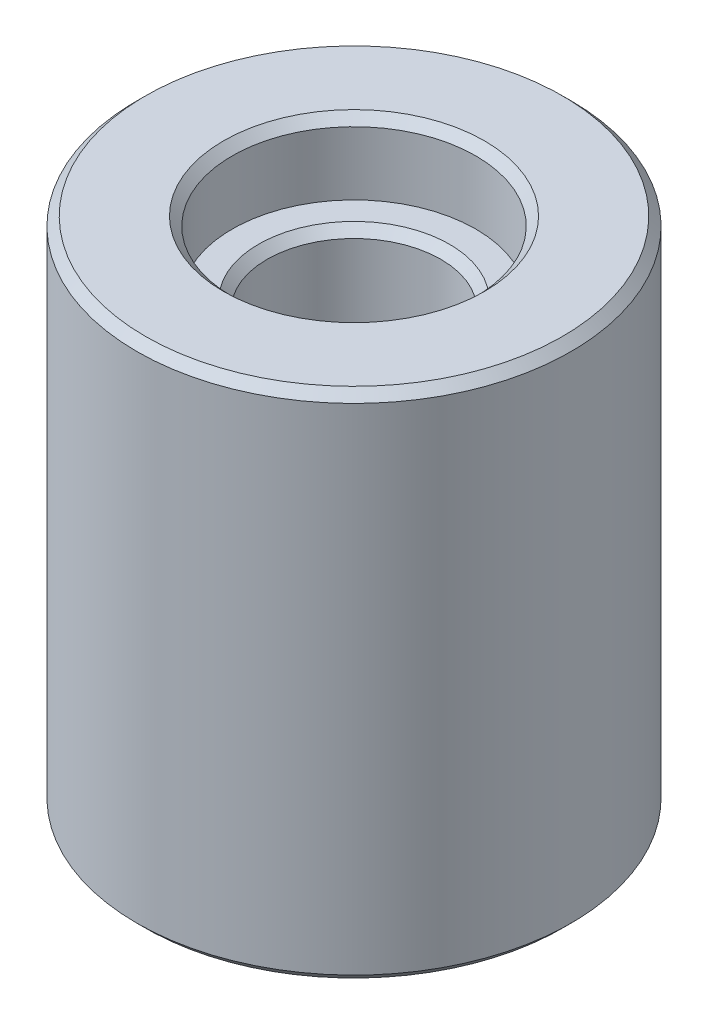
ISO-10303-21;
HEADER;
FILE_DESCRIPTION(('STEP AP214'),'2;1');
FILE_NAME('part.step','',(''),(''),'','','');
FILE_SCHEMA(('AUTOMOTIVE_DESIGN { 1 0 10303 214 1 1 1 1 }'));
ENDSEC;
DATA;
#1=APPLICATION_CONTEXT('core data for automotive mechanical design processes');
#2=APPLICATION_PROTOCOL_DEFINITION('international standard','automotive_design',2000,#1);
#3=PRODUCT_CONTEXT('',#1,'mechanical');
#4=PRODUCT('Part','Part','',(#3));
#5=PRODUCT_RELATED_PRODUCT_CATEGORY('part','',(#4));
#6=PRODUCT_DEFINITION_FORMATION('','',#4);
#7=PRODUCT_DEFINITION_CONTEXT('part definition',#1,'design');
#8=PRODUCT_DEFINITION('design','',#6,#7);
#9=PRODUCT_DEFINITION_SHAPE('','',#8);
#10=(LENGTH_UNIT() NAMED_UNIT(*) SI_UNIT(.MILLI.,.METRE.));
#11=(NAMED_UNIT(*) PLANE_ANGLE_UNIT() SI_UNIT($,.RADIAN.));
#12=(NAMED_UNIT(*) SI_UNIT($,.STERADIAN.) SOLID_ANGLE_UNIT());
#13=UNCERTAINTY_MEASURE_WITH_UNIT(LENGTH_MEASURE(1.E-05),#10,'distance_accuracy_value','');
#14=(GEOMETRIC_REPRESENTATION_CONTEXT(3) GLOBAL_UNCERTAINTY_ASSIGNED_CONTEXT((#13)) GLOBAL_UNIT_ASSIGNED_CONTEXT((#10,
#11,#12)) REPRESENTATION_CONTEXT('',''));
#15=CARTESIAN_POINT('',(0.,0.,0.));
#16=DIRECTION('',(0.,0.,1.));
#17=DIRECTION('',(1.,0.,0.));
#18=AXIS2_PLACEMENT_3D('',#15,#16,#17);
#19=CARTESIAN_POINT('',(-13.975,0.,0.));
#20=DIRECTION('',(0.,-1.,0.));
#21=DIRECTION('',(0.,0.,-1.));
#22=AXIS2_PLACEMENT_3D('',#19,#20,#21);
#23=PLANE('',#22);
#24=CARTESIAN_POINT('',(-1.36167772214882E-13,0.,-19.5));
#25=DIRECTION('',(0.,-1.,0.));
#26=DIRECTION('',(0.,0.,-1.));
#27=AXIS2_PLACEMENT_3D('',#24,#25,#26);
#28=CIRCLE('',#27,2.99999999999997);
#29=CARTESIAN_POINT('',(-1.36167772214882E-13,0.,-22.5));
#30=VERTEX_POINT('',#29);
#31=EDGE_CURVE('E155',#30,#30,#28,.F.);
#32=ORIENTED_EDGE('',*,*,#31,.T.);
#33=EDGE_LOOP('',(#32));
#34=FACE_BOUND('',#33,.T.);
#35=CARTESIAN_POINT('',(-19.5,0.,2.04251658322323E-13));
#36=DIRECTION('',(0.,-1.,0.));
#37=DIRECTION('',(0.,0.,-1.));
#38=AXIS2_PLACEMENT_3D('',#35,#36,#37);
#39=CIRCLE('',#38,2.99999999999998);
#40=CARTESIAN_POINT('',(-19.5,0.,-2.99999999999977));
#41=VERTEX_POINT('',#40);
#42=EDGE_CURVE('E152',#41,#41,#39,.F.);
#43=ORIENTED_EDGE('',*,*,#42,.T.);
#44=EDGE_LOOP('',(#43));
#45=FACE_BOUND('',#44,.T.);
#46=CARTESIAN_POINT('',(19.5,0.,0.));
#47=DIRECTION('',(0.,-1.,0.));
#48=DIRECTION('',(0.,0.,-1.));
#49=AXIS2_PLACEMENT_3D('',#46,#47,#48);
#50=CIRCLE('',#49,2.99999999999998);
#51=CARTESIAN_POINT('',(19.5,0.,-2.99999999999998));
#52=VERTEX_POINT('',#51);
#53=EDGE_CURVE('E149',#52,#52,#50,.F.);
#54=ORIENTED_EDGE('',*,*,#53,.T.);
#55=EDGE_LOOP('',(#54));
#56=FACE_BOUND('',#55,.T.);
#57=CARTESIAN_POINT('',(0.,0.,19.5));
#58=DIRECTION('',(0.,-1.,0.));
#59=DIRECTION('',(0.,0.,-1.));
#60=AXIS2_PLACEMENT_3D('',#57,#58,#59);
#61=CIRCLE('',#60,2.99999999999997);
#62=CARTESIAN_POINT('',(0.,0.,16.5));
#63=VERTEX_POINT('',#62);
#64=EDGE_CURVE('E146',#63,#63,#61,.F.);
#65=ORIENTED_EDGE('',*,*,#64,.T.);
#66=EDGE_LOOP('',(#65));
#67=FACE_BOUND('',#66,.T.);
#68=CARTESIAN_POINT('',(0.,0.,0.));
#69=DIRECTION('',(0.,-1.,0.));
#70=DIRECTION('',(0.,0.,-1.));
#71=AXIS2_PLACEMENT_3D('',#68,#69,#70);
#72=CIRCLE('',#71,24.);
#73=CARTESIAN_POINT('',(0.,0.,-24.));
#74=VERTEX_POINT('',#73);
#75=EDGE_CURVE('E140',#74,#74,#72,.T.);
#76=ORIENTED_EDGE('',*,*,#75,.T.);
#77=EDGE_LOOP('',(#76));
#78=FACE_BOUND('',#77,.T.);
#79=CARTESIAN_POINT('',(0.,0.,0.));
#80=DIRECTION('',(0.,-1.,0.));
#81=DIRECTION('',(0.,0.,-1.));
#82=AXIS2_PLACEMENT_3D('',#79,#80,#81);
#83=CIRCLE('',#82,14.975);
#84=CARTESIAN_POINT('',(0.,0.,-14.975));
#85=VERTEX_POINT('',#84);
#86=EDGE_CURVE('E107',#85,#85,#83,.F.);
#87=ORIENTED_EDGE('',*,*,#86,.T.);
#88=EDGE_LOOP('',(#87));
#89=FACE_BOUND('',#88,.T.);
#90=ADVANCED_FACE('F46',(#34,#45,#56,#67,#78,#89),#23,.T.);
#91=CARTESIAN_POINT('',(0.,0.,0.));
#92=DIRECTION('',(0.,1.,0.));
#93=DIRECTION('',(0.,0.,1.));
#94=AXIS2_PLACEMENT_3D('',#91,#92,#93);
#95=CYLINDRICAL_SURFACE('',#94,25.);
#96=CARTESIAN_POINT('',(0.,58.,0.));
#97=DIRECTION('',(0.,1.,0.));
#98=DIRECTION('',(0.,0.,1.));
#99=AXIS2_PLACEMENT_3D('',#96,#97,#98);
#100=CIRCLE('',#99,25.);
#101=CARTESIAN_POINT('',(0.,58.,25.));
#102=VERTEX_POINT('',#101);
#103=EDGE_CURVE('E137',#102,#102,#100,.F.);
#104=ORIENTED_EDGE('',*,*,#103,.T.);
#105=EDGE_LOOP('',(#104));
#106=FACE_BOUND('',#105,.T.);
#107=CARTESIAN_POINT('',(0.,1.,0.));
#108=DIRECTION('',(0.,-1.,0.));
#109=DIRECTION('',(0.,0.,-1.));
#110=AXIS2_PLACEMENT_3D('',#107,#108,#109);
#111=CIRCLE('',#110,25.);
#112=CARTESIAN_POINT('',(0.,1.,-25.));
#113=VERTEX_POINT('',#112);
#114=EDGE_CURVE('E134',#113,#113,#111,.F.);
#115=ORIENTED_EDGE('',*,*,#114,.T.);
#116=EDGE_LOOP('',(#115));
#117=FACE_BOUND('',#116,.T.);
#118=ADVANCED_FACE('F181',(#106,#117),#95,.T.);
#119=CARTESIAN_POINT('',(-25.,59.,0.));
#120=DIRECTION('',(0.,1.,0.));
#121=DIRECTION('',(0.,0.,1.));
#122=AXIS2_PLACEMENT_3D('',#119,#120,#121);
#123=PLANE('',#122);
#124=CARTESIAN_POINT('',(0.,59.,0.));
#125=DIRECTION('',(0.,1.,0.));
#126=DIRECTION('',(0.,0.,1.));
#127=AXIS2_PLACEMENT_3D('',#124,#125,#126);
#128=CIRCLE('',#127,24.);
#129=CARTESIAN_POINT('',(0.,59.,24.));
#130=VERTEX_POINT('',#129);
#131=EDGE_CURVE('E131',#130,#130,#128,.T.);
#132=ORIENTED_EDGE('',*,*,#131,.T.);
#133=EDGE_LOOP('',(#132));
#134=FACE_BOUND('',#133,.T.);
#135=CARTESIAN_POINT('',(0.,59.,0.));
#136=DIRECTION('',(0.,1.,0.));
#137=DIRECTION('',(0.,0.,1.));
#138=AXIS2_PLACEMENT_3D('',#135,#136,#137);
#139=CIRCLE('',#138,15.025);
#140=CARTESIAN_POINT('',(0.,59.,15.025));
#141=VERTEX_POINT('',#140);
#142=EDGE_CURVE('E116',#141,#141,#139,.F.);
#143=ORIENTED_EDGE('',*,*,#142,.T.);
#144=EDGE_LOOP('',(#143));
#145=FACE_BOUND('',#144,.T.);
#146=ADVANCED_FACE('F187',(#134,#145),#123,.T.);
#147=CARTESIAN_POINT('',(0.,0.,0.));
#148=DIRECTION('',(0.,1.,0.));
#149=DIRECTION('',(0.,0.,1.));
#150=AXIS2_PLACEMENT_3D('',#147,#148,#149);
#151=CYLINDRICAL_SURFACE('',#150,14.025);
#152=CARTESIAN_POINT('',(0.,58.,0.));
#153=DIRECTION('',(0.,1.,0.));
#154=DIRECTION('',(0.,0.,1.));
#155=AXIS2_PLACEMENT_3D('',#152,#153,#154);
#156=CIRCLE('',#155,14.025);
#157=CARTESIAN_POINT('',(0.,58.,14.025));
#158=VERTEX_POINT('',#157);
#159=EDGE_CURVE('E113',#158,#158,#156,.T.);
#160=ORIENTED_EDGE('',*,*,#159,.T.);
#161=EDGE_LOOP('',(#160));
#162=FACE_BOUND('',#161,.T.);
#163=CARTESIAN_POINT('',(0.,50.7,0.));
#164=DIRECTION('',(0.,1.,0.));
#165=DIRECTION('',(0.,0.,1.));
#166=AXIS2_PLACEMENT_3D('',#163,#164,#165);
#167=CIRCLE('',#166,14.025);
#168=CARTESIAN_POINT('',(0.,50.7,14.025));
#169=VERTEX_POINT('',#168);
#170=EDGE_CURVE('E104',#169,#169,#167,.T.);
#171=ORIENTED_EDGE('',*,*,#170,.F.);
#172=EDGE_LOOP('',(#171));
#173=FACE_BOUND('',#172,.T.);
#174=ADVANCED_FACE('F308',(#162,#173),#151,.F.);
#175=CARTESIAN_POINT('',(-14.025,50.7,0.));
#176=DIRECTION('',(0.,1.,0.));
#177=DIRECTION('',(0.,0.,1.));
#178=AXIS2_PLACEMENT_3D('',#175,#176,#177);
#179=PLANE('',#178);
#180=CARTESIAN_POINT('',(0.,50.7,0.));
#181=DIRECTION('',(0.,1.,0.));
#182=DIRECTION('',(0.,0.,1.));
#183=AXIS2_PLACEMENT_3D('',#180,#181,#182);
#184=CIRCLE('',#183,11.);
#185=CARTESIAN_POINT('',(0.,50.7,11.));
#186=VERTEX_POINT('',#185);
#187=EDGE_CURVE('E128',#186,#186,#184,.F.);
#188=ORIENTED_EDGE('',*,*,#187,.T.);
#189=EDGE_LOOP('',(#188));
#190=FACE_BOUND('',#189,.T.);
#191=ORIENTED_EDGE('',*,*,#170,.T.);
#192=EDGE_LOOP('',(#191));
#193=FACE_BOUND('',#192,.T.);
#194=ADVANCED_FACE('F304',(#190,#193),#179,.T.);
#195=CARTESIAN_POINT('',(0.,0.,0.));
#196=DIRECTION('',(0.,1.,0.));
#197=DIRECTION('',(0.,0.,1.));
#198=AXIS2_PLACEMENT_3D('',#195,#196,#197);
#199=CYLINDRICAL_SURFACE('',#198,10.);
#200=CARTESIAN_POINT('',(0.,12.9998958328812,0.));
#201=DIRECTION('',(0.,-1.,0.));
#202=DIRECTION('',(0.,0.,-1.));
#203=AXIS2_PLACEMENT_3D('',#200,#201,#202);
#204=CIRCLE('',#203,10.);
#205=CARTESIAN_POINT('',(0.,12.9998958328812,-10.));
#206=VERTEX_POINT('',#205);
#207=EDGE_CURVE('E125',#206,#206,#204,.T.);
#208=ORIENTED_EDGE('',*,*,#207,.T.);
#209=EDGE_LOOP('',(#208));
#210=FACE_BOUND('',#209,.T.);
#211=CARTESIAN_POINT('',(0.,49.7,0.));
#212=DIRECTION('',(0.,1.,0.));
#213=DIRECTION('',(0.,0.,1.));
#214=AXIS2_PLACEMENT_3D('',#211,#212,#213);
#215=CIRCLE('',#214,10.);
#216=CARTESIAN_POINT('',(0.,49.7,10.));
#217=VERTEX_POINT('',#216);
#218=EDGE_CURVE('E122',#217,#217,#215,.T.);
#219=ORIENTED_EDGE('',*,*,#218,.T.);
#220=EDGE_LOOP('',(#219));
#221=FACE_BOUND('',#220,.T.);
#222=ADVANCED_FACE('F300',(#210,#221),#199,.F.);
#223=CARTESIAN_POINT('',(-10.,11.9998958328812,0.));
#224=DIRECTION('',(0.,-1.,0.));
#225=DIRECTION('',(0.,0.,-1.));
#226=AXIS2_PLACEMENT_3D('',#223,#224,#225);
#227=PLANE('',#226);
#228=CARTESIAN_POINT('',(0.,11.9998958328812,0.));
#229=DIRECTION('',(0.,-1.,0.));
#230=DIRECTION('',(0.,0.,-1.));
#231=AXIS2_PLACEMENT_3D('',#228,#229,#230);
#232=CIRCLE('',#231,11.);
#233=CARTESIAN_POINT('',(0.,11.9998958328812,-11.));
#234=VERTEX_POINT('',#233);
#235=EDGE_CURVE('E119',#234,#234,#232,.F.);
#236=ORIENTED_EDGE('',*,*,#235,.T.);
#237=EDGE_LOOP('',(#236));
#238=FACE_BOUND('',#237,.T.);
#239=CARTESIAN_POINT('',(0.,11.9998958328812,0.));
#240=DIRECTION('',(0.,1.,0.));
#241=DIRECTION('',(0.,0.,1.));
#242=AXIS2_PLACEMENT_3D('',#239,#240,#241);
#243=CIRCLE('',#242,14.025);
#244=CARTESIAN_POINT('',(0.,11.9998958328812,14.025));
#245=VERTEX_POINT('',#244);
#246=EDGE_CURVE('E101',#245,#245,#243,.T.);
#247=ORIENTED_EDGE('',*,*,#246,.F.);
#248=EDGE_LOOP('',(#247));
#249=FACE_BOUND('',#248,.T.);
#250=ADVANCED_FACE('F296',(#238,#249),#227,.T.);
#251=CARTESIAN_POINT('',(0.,0.,0.));
#252=DIRECTION('',(0.,1.,0.));
#253=DIRECTION('',(0.,0.,1.));
#254=AXIS2_PLACEMENT_3D('',#251,#252,#253);
#255=CYLINDRICAL_SURFACE('',#254,14.025);
#256=ORIENTED_EDGE('',*,*,#246,.T.);
#257=EDGE_LOOP('',(#256));
#258=FACE_BOUND('',#257,.T.);
#259=CARTESIAN_POINT('',(0.,3.99989583288123,0.));
#260=DIRECTION('',(0.,1.,0.));
#261=DIRECTION('',(0.,0.,1.));
#262=AXIS2_PLACEMENT_3D('',#259,#260,#261);
#263=CIRCLE('',#262,14.025);
#264=CARTESIAN_POINT('',(0.,3.99989583288123,14.025));
#265=VERTEX_POINT('',#264);
#266=EDGE_CURVE('E98',#265,#265,#263,.T.);
#267=ORIENTED_EDGE('',*,*,#266,.F.);
#268=EDGE_LOOP('',(#267));
#269=FACE_BOUND('',#268,.T.);
#270=ADVANCED_FACE('F292',(#258,#269),#255,.F.);
#271=CARTESIAN_POINT('',(-14.025,3.99989583288123,0.));
#272=DIRECTION('',(0.,-1.,0.));
#273=DIRECTION('',(0.,0.,-1.));
#274=AXIS2_PLACEMENT_3D('',#271,#272,#273);
#275=PLANE('',#274);
#276=ORIENTED_EDGE('',*,*,#266,.T.);
#277=EDGE_LOOP('',(#276));
#278=FACE_BOUND('',#277,.T.);
#279=CARTESIAN_POINT('',(0.,3.99989583288123,0.));
#280=DIRECTION('',(0.,1.,0.));
#281=DIRECTION('',(0.,0.,1.));
#282=AXIS2_PLACEMENT_3D('',#279,#280,#281);
#283=CIRCLE('',#282,14.6);
#284=CARTESIAN_POINT('',(0.,3.99989583288123,14.6));
#285=VERTEX_POINT('',#284);
#286=EDGE_CURVE('E95',#285,#285,#283,.T.);
#287=ORIENTED_EDGE('',*,*,#286,.F.);
#288=EDGE_LOOP('',(#287));
#289=FACE_BOUND('',#288,.T.);
#290=ADVANCED_FACE('F288',(#278,#289),#275,.T.);
#291=CARTESIAN_POINT('',(0.,0.,0.));
#292=DIRECTION('',(0.,1.,0.));
#293=DIRECTION('',(0.,0.,1.));
#294=AXIS2_PLACEMENT_3D('',#291,#292,#293);
#295=CYLINDRICAL_SURFACE('',#294,14.6);
#296=ORIENTED_EDGE('',*,*,#286,.T.);
#297=EDGE_LOOP('',(#296));
#298=FACE_BOUND('',#297,.T.);
#299=CARTESIAN_POINT('',(0.,2.69989583288123,0.));
#300=DIRECTION('',(0.,1.,0.));
#301=DIRECTION('',(0.,0.,1.));
#302=AXIS2_PLACEMENT_3D('',#299,#300,#301);
#303=CIRCLE('',#302,14.6);
#304=CARTESIAN_POINT('',(0.,2.69989583288123,14.6));
#305=VERTEX_POINT('',#304);
#306=EDGE_CURVE('E92',#305,#305,#303,.T.);
#307=ORIENTED_EDGE('',*,*,#306,.F.);
#308=EDGE_LOOP('',(#307));
#309=FACE_BOUND('',#308,.T.);
#310=ADVANCED_FACE('F284',(#298,#309),#295,.F.);
#311=CARTESIAN_POINT('',(-14.6,2.69989583288123,0.));
#312=DIRECTION('',(0.,1.,0.));
#313=DIRECTION('',(0.,0.,1.));
#314=AXIS2_PLACEMENT_3D('',#311,#312,#313);
#315=PLANE('',#314);
#316=ORIENTED_EDGE('',*,*,#306,.T.);
#317=EDGE_LOOP('',(#316));
#318=FACE_BOUND('',#317,.T.);
#319=CARTESIAN_POINT('',(0.,2.69989583288123,0.));
#320=DIRECTION('',(0.,1.,0.));
#321=DIRECTION('',(0.,0.,1.));
#322=AXIS2_PLACEMENT_3D('',#319,#320,#321);
#323=CIRCLE('',#322,13.975);
#324=CARTESIAN_POINT('',(0.,2.69989583288123,13.975));
#325=VERTEX_POINT('',#324);
#326=EDGE_CURVE('E89',#325,#325,#323,.T.);
#327=ORIENTED_EDGE('',*,*,#326,.F.);
#328=EDGE_LOOP('',(#327));
#329=FACE_BOUND('',#328,.T.);
#330=ADVANCED_FACE('F280',(#318,#329),#315,.T.);
#331=CARTESIAN_POINT('',(0.,0.,0.));
#332=DIRECTION('',(0.,1.,0.));
#333=DIRECTION('',(0.,0.,1.));
#334=AXIS2_PLACEMENT_3D('',#331,#332,#333);
#335=CYLINDRICAL_SURFACE('',#334,13.975);
#336=CARTESIAN_POINT('',(0.,1.00000000000001,0.));
#337=DIRECTION('',(0.,-1.,0.));
#338=DIRECTION('',(0.,0.,-1.));
#339=AXIS2_PLACEMENT_3D('',#336,#337,#338);
#340=CIRCLE('',#339,13.975);
#341=CARTESIAN_POINT('',(0.,1.00000000000001,-13.975));
#342=VERTEX_POINT('',#341);
#343=EDGE_CURVE('E110',#342,#342,#340,.T.);
#344=ORIENTED_EDGE('',*,*,#343,.T.);
#345=EDGE_LOOP('',(#344));
#346=FACE_BOUND('',#345,.T.);
#347=ORIENTED_EDGE('',*,*,#326,.T.);
#348=EDGE_LOOP('',(#347));
#349=FACE_BOUND('',#348,.T.);
#350=ADVANCED_FACE('F201',(#346,#349),#335,.F.);
#351=CARTESIAN_POINT('',(0.,0.,0.));
#352=DIRECTION('',(0.,-1.,0.));
#353=DIRECTION('',(0.,0.,-1.));
#354=AXIS2_PLACEMENT_3D('',#351,#352,#353);
#355=CONICAL_SURFACE('',#354,14.975,0.785398163397451);
#356=ORIENTED_EDGE('',*,*,#343,.F.);
#357=EDGE_LOOP('',(#356));
#358=FACE_BOUND('',#357,.T.);
#359=ORIENTED_EDGE('',*,*,#86,.F.);
#360=EDGE_LOOP('',(#359));
#361=FACE_BOUND('',#360,.T.);
#362=ADVANCED_FACE('F194',(#358,#361),#355,.F.);
#363=CARTESIAN_POINT('',(0.,58.,0.));
#364=DIRECTION('',(0.,1.,0.));
#365=DIRECTION('',(0.,0.,1.));
#366=AXIS2_PLACEMENT_3D('',#363,#364,#365);
#367=CONICAL_SURFACE('',#366,14.025,0.785398163397449);
#368=ORIENTED_EDGE('',*,*,#142,.F.);
#369=EDGE_LOOP('',(#368));
#370=FACE_BOUND('',#369,.T.);
#371=ORIENTED_EDGE('',*,*,#159,.F.);
#372=EDGE_LOOP('',(#371));
#373=FACE_BOUND('',#372,.T.);
#374=ADVANCED_FACE('F200',(#370,#373),#367,.F.);
#375=CARTESIAN_POINT('',(0.,11.9998958328812,0.));
#376=DIRECTION('',(0.,-1.,0.));
#377=DIRECTION('',(0.,0.,-1.));
#378=AXIS2_PLACEMENT_3D('',#375,#376,#377);
#379=CONICAL_SURFACE('',#378,11.,0.785398163397445);
#380=ORIENTED_EDGE('',*,*,#207,.F.);
#381=EDGE_LOOP('',(#380));
#382=FACE_BOUND('',#381,.T.);
#383=ORIENTED_EDGE('',*,*,#235,.F.);
#384=EDGE_LOOP('',(#383));
#385=FACE_BOUND('',#384,.T.);
#386=ADVANCED_FACE('F208',(#382,#385),#379,.F.);
#387=CARTESIAN_POINT('',(0.,49.7,0.));
#388=DIRECTION('',(0.,1.,0.));
#389=DIRECTION('',(0.,0.,1.));
#390=AXIS2_PLACEMENT_3D('',#387,#388,#389);
#391=CONICAL_SURFACE('',#390,10.,0.785398163397452);
#392=ORIENTED_EDGE('',*,*,#187,.F.);
#393=EDGE_LOOP('',(#392));
#394=FACE_BOUND('',#393,.T.);
#395=ORIENTED_EDGE('',*,*,#218,.F.);
#396=EDGE_LOOP('',(#395));
#397=FACE_BOUND('',#396,.T.);
#398=ADVANCED_FACE('F215',(#394,#397),#391,.F.);
#399=CARTESIAN_POINT('',(19.5,12.,0.));
#400=DIRECTION('',(0.,-1.,0.));
#401=DIRECTION('',(0.,0.,-1.));
#402=AXIS2_PLACEMENT_3D('',#399,#400,#401);
#403=CONICAL_SURFACE('',#402,2.5,1.02974425867665);
#404=CARTESIAN_POINT('',(19.5,13.5021515475689,0.));
#405=VERTEX_POINT('',#404);
#406=VERTEX_LOOP('',#405);
#407=FACE_BOUND('',#406,.T.);
#408=CARTESIAN_POINT('',(19.5,12.,0.));
#409=DIRECTION('',(0.,-1.,0.));
#410=DIRECTION('',(0.,0.,-1.));
#411=AXIS2_PLACEMENT_3D('',#408,#409,#410);
#412=CIRCLE('',#411,2.5);
#413=CARTESIAN_POINT('',(19.5,12.,-2.5));
#414=VERTEX_POINT('',#413);
#415=EDGE_CURVE('E86',#414,#414,#412,.T.);
#416=ORIENTED_EDGE('',*,*,#415,.T.);
#417=EDGE_LOOP('',(#416));
#418=FACE_BOUND('',#417,.T.);
#419=ADVANCED_FACE('F222',(#407,#418),#403,.F.);
#420=CARTESIAN_POINT('',(19.5,0.,0.));
#421=DIRECTION('',(0.,-1.,0.));
#422=DIRECTION('',(0.,0.,-1.));
#423=AXIS2_PLACEMENT_3D('',#420,#421,#422);
#424=CYLINDRICAL_SURFACE('',#423,2.5);
#425=CARTESIAN_POINT('',(19.5,0.499999999999984,0.));
#426=DIRECTION('',(0.,-1.,0.));
#427=DIRECTION('',(0.,0.,-1.));
#428=AXIS2_PLACEMENT_3D('',#425,#426,#427);
#429=CIRCLE('',#428,2.5);
#430=CARTESIAN_POINT('',(19.5,0.499999999999984,-2.5));
#431=VERTEX_POINT('',#430);
#432=EDGE_CURVE('E55',#431,#431,#429,.T.);
#433=ORIENTED_EDGE('',*,*,#432,.T.);
#434=EDGE_LOOP('',(#433));
#435=FACE_BOUND('',#434,.T.);
#436=ORIENTED_EDGE('',*,*,#415,.F.);
#437=EDGE_LOOP('',(#436));
#438=FACE_BOUND('',#437,.T.);
#439=ADVANCED_FACE('F163',(#435,#438),#424,.F.);
#440=CARTESIAN_POINT('',(0.,12.,19.5));
#441=DIRECTION('',(0.,-1.,0.));
#442=DIRECTION('',(0.,0.,-1.));
#443=AXIS2_PLACEMENT_3D('',#440,#441,#442);
#444=CONICAL_SURFACE('',#443,2.5,1.02974425867665);
#445=CARTESIAN_POINT('',(0.,13.5021515475689,19.5));
#446=VERTEX_POINT('',#445);
#447=VERTEX_LOOP('',#446);
#448=FACE_BOUND('',#447,.T.);
#449=CARTESIAN_POINT('',(0.,12.,19.5));
#450=DIRECTION('',(0.,-1.,0.));
#451=DIRECTION('',(0.,0.,-1.));
#452=AXIS2_PLACEMENT_3D('',#449,#450,#451);
#453=CIRCLE('',#452,2.5);
#454=CARTESIAN_POINT('',(0.,12.,17.));
#455=VERTEX_POINT('',#454);
#456=EDGE_CURVE('E81',#455,#455,#453,.T.);
#457=ORIENTED_EDGE('',*,*,#456,.T.);
#458=EDGE_LOOP('',(#457));
#459=FACE_BOUND('',#458,.T.);
#460=ADVANCED_FACE('F270',(#448,#459),#444,.F.);
#461=CARTESIAN_POINT('',(0.,0.,19.5));
#462=DIRECTION('',(0.,-1.,0.));
#463=DIRECTION('',(0.,0.,-1.));
#464=AXIS2_PLACEMENT_3D('',#461,#462,#463);
#465=CYLINDRICAL_SURFACE('',#464,2.49999999999999);
#466=CARTESIAN_POINT('',(0.,0.499999999999986,19.5));
#467=DIRECTION('',(0.,-1.,0.));
#468=DIRECTION('',(0.,0.,-1.));
#469=AXIS2_PLACEMENT_3D('',#466,#467,#468);
#470=CIRCLE('',#469,2.49999999999999);
#471=CARTESIAN_POINT('',(0.,0.499999999999986,17.));
#472=VERTEX_POINT('',#471);
#473=EDGE_CURVE('E11',#472,#472,#470,.T.);
#474=ORIENTED_EDGE('',*,*,#473,.T.);
#475=EDGE_LOOP('',(#474));
#476=FACE_BOUND('',#475,.T.);
#477=ORIENTED_EDGE('',*,*,#456,.F.);
#478=EDGE_LOOP('',(#477));
#479=FACE_BOUND('',#478,.T.);
#480=ADVANCED_FACE('F266',(#476,#479),#465,.F.);
#481=CARTESIAN_POINT('',(-19.5,12.,2.04251658322323E-13));
#482=DIRECTION('',(0.,-1.,0.));
#483=DIRECTION('',(0.,0.,-1.));
#484=AXIS2_PLACEMENT_3D('',#481,#482,#483);
#485=CONICAL_SURFACE('',#484,2.5,1.02974425867665);
#486=CARTESIAN_POINT('',(-19.5,13.5021515475689,2.04251658322323E-13));
#487=VERTEX_POINT('',#486);
#488=VERTEX_LOOP('',#487);
#489=FACE_BOUND('',#488,.T.);
#490=CARTESIAN_POINT('',(-19.5,12.,2.04251658322323E-13));
#491=DIRECTION('',(0.,-1.,0.));
#492=DIRECTION('',(0.,0.,-1.));
#493=AXIS2_PLACEMENT_3D('',#490,#491,#492);
#494=CIRCLE('',#493,2.5);
#495=CARTESIAN_POINT('',(-19.5,12.,-2.49999999999979));
#496=VERTEX_POINT('',#495);
#497=EDGE_CURVE('E78',#496,#496,#494,.T.);
#498=ORIENTED_EDGE('',*,*,#497,.T.);
#499=EDGE_LOOP('',(#498));
#500=FACE_BOUND('',#499,.T.);
#501=ADVANCED_FACE('F262',(#489,#500),#485,.F.);
#502=CARTESIAN_POINT('',(-19.5,0.,2.04251658322323E-13));
#503=DIRECTION('',(0.,-1.,0.));
#504=DIRECTION('',(0.,0.,-1.));
#505=AXIS2_PLACEMENT_3D('',#502,#503,#504);
#506=CYLINDRICAL_SURFACE('',#505,2.5);
#507=CARTESIAN_POINT('',(-19.5,0.499999999999984,2.04251658322323E-13));
#508=DIRECTION('',(0.,-1.,0.));
#509=DIRECTION('',(0.,0.,-1.));
#510=AXIS2_PLACEMENT_3D('',#507,#508,#509);
#511=CIRCLE('',#510,2.5);
#512=CARTESIAN_POINT('',(-19.5,0.499999999999984,-2.49999999999979));
#513=VERTEX_POINT('',#512);
#514=EDGE_CURVE('E158',#513,#513,#511,.T.);
#515=ORIENTED_EDGE('',*,*,#514,.T.);
#516=EDGE_LOOP('',(#515));
#517=FACE_BOUND('',#516,.T.);
#518=ORIENTED_EDGE('',*,*,#497,.F.);
#519=EDGE_LOOP('',(#518));
#520=FACE_BOUND('',#519,.T.);
#521=ADVANCED_FACE('F72',(#517,#520),#506,.F.);
#522=CARTESIAN_POINT('',(-1.36167772214882E-13,12.,-19.5));
#523=DIRECTION('',(0.,-1.,0.));
#524=DIRECTION('',(0.,0.,-1.));
#525=AXIS2_PLACEMENT_3D('',#522,#523,#524);
#526=CONICAL_SURFACE('',#525,2.5,1.02974425867665);
#527=CARTESIAN_POINT('',(-1.39474845549749E-13,13.5021515475689,-19.5));
#528=VERTEX_POINT('',#527);
#529=VERTEX_LOOP('',#528);
#530=FACE_BOUND('',#529,.T.);
#531=CARTESIAN_POINT('',(-1.36167772214882E-13,12.,-19.5));
#532=DIRECTION('',(0.,-1.,0.));
#533=DIRECTION('',(0.,0.,-1.));
#534=AXIS2_PLACEMENT_3D('',#531,#532,#533);
#535=CIRCLE('',#534,2.5);
#536=CARTESIAN_POINT('',(-1.36167772214882E-13,12.,-22.));
#537=VERTEX_POINT('',#536);
#538=EDGE_CURVE('E76',#537,#537,#535,.T.);
#539=ORIENTED_EDGE('',*,*,#538,.T.);
#540=EDGE_LOOP('',(#539));
#541=FACE_BOUND('',#540,.T.);
#542=ADVANCED_FACE('F68',(#530,#541),#526,.F.);
#543=CARTESIAN_POINT('',(-1.36167772214882E-13,0.,-19.5));
#544=DIRECTION('',(0.,-1.,0.));
#545=DIRECTION('',(0.,0.,-1.));
#546=AXIS2_PLACEMENT_3D('',#543,#544,#545);
#547=CYLINDRICAL_SURFACE('',#546,2.49999999999999);
#548=CARTESIAN_POINT('',(-1.36167772214882E-13,0.499999999999986,-19.5));
#549=DIRECTION('',(0.,-1.,0.));
#550=DIRECTION('',(0.,0.,-1.));
#551=AXIS2_PLACEMENT_3D('',#548,#549,#550);
#552=CIRCLE('',#551,2.49999999999999);
#553=CARTESIAN_POINT('',(-1.36167772214882E-13,0.499999999999986,-22.));
#554=VERTEX_POINT('',#553);
#555=EDGE_CURVE('E143',#554,#554,#552,.T.);
#556=ORIENTED_EDGE('',*,*,#555,.T.);
#557=EDGE_LOOP('',(#556));
#558=FACE_BOUND('',#557,.T.);
#559=ORIENTED_EDGE('',*,*,#538,.F.);
#560=EDGE_LOOP('',(#559));
#561=FACE_BOUND('',#560,.T.);
#562=ADVANCED_FACE('F71',(#558,#561),#547,.F.);
#563=CARTESIAN_POINT('',(0.,59.,0.));
#564=DIRECTION('',(0.,-1.,0.));
#565=DIRECTION('',(0.,0.,-1.));
#566=AXIS2_PLACEMENT_3D('',#563,#564,#565);
#567=CONICAL_SURFACE('',#566,24.,0.785398163397455);
#568=ORIENTED_EDGE('',*,*,#103,.F.);
#569=EDGE_LOOP('',(#568));
#570=FACE_BOUND('',#569,.T.);
#571=ORIENTED_EDGE('',*,*,#131,.F.);
#572=EDGE_LOOP('',(#571));
#573=FACE_BOUND('',#572,.T.);
#574=ADVANCED_FACE('F224',(#570,#573),#567,.T.);
#575=CARTESIAN_POINT('',(0.,1.,0.));
#576=DIRECTION('',(0.,1.,0.));
#577=DIRECTION('',(0.,0.,1.));
#578=AXIS2_PLACEMENT_3D('',#575,#576,#577);
#579=CONICAL_SURFACE('',#578,25.,0.785398163397454);
#580=ORIENTED_EDGE('',*,*,#75,.F.);
#581=EDGE_LOOP('',(#580));
#582=FACE_BOUND('',#581,.T.);
#583=ORIENTED_EDGE('',*,*,#114,.F.);
#584=EDGE_LOOP('',(#583));
#585=FACE_BOUND('',#584,.T.);
#586=ADVANCED_FACE('F230',(#582,#585),#579,.T.);
#587=CARTESIAN_POINT('',(-1.36167772214882E-13,0.499999999999986,-19.5));
#588=DIRECTION('',(0.,-1.,0.));
#589=DIRECTION('',(0.,0.,-1.));
#590=AXIS2_PLACEMENT_3D('',#587,#588,#589);
#591=CONICAL_SURFACE('',#590,2.49999999999999,0.78539816339745);
#592=ORIENTED_EDGE('',*,*,#31,.F.);
#593=EDGE_LOOP('',(#592));
#594=FACE_BOUND('',#593,.T.);
#595=ORIENTED_EDGE('',*,*,#555,.F.);
#596=EDGE_LOOP('',(#595));
#597=FACE_BOUND('',#596,.T.);
#598=ADVANCED_FACE('F175',(#594,#597),#591,.F.);
#599=CARTESIAN_POINT('',(-19.5,0.499999999999984,2.04251658322323E-13));
#600=DIRECTION('',(0.,-1.,0.));
#601=DIRECTION('',(0.,0.,-1.));
#602=AXIS2_PLACEMENT_3D('',#599,#600,#601);
#603=CONICAL_SURFACE('',#602,2.5,0.785398163397453);
#604=ORIENTED_EDGE('',*,*,#42,.F.);
#605=EDGE_LOOP('',(#604));
#606=FACE_BOUND('',#605,.T.);
#607=ORIENTED_EDGE('',*,*,#514,.F.);
#608=EDGE_LOOP('',(#607));
#609=FACE_BOUND('',#608,.T.);
#610=ADVANCED_FACE('F168',(#606,#609),#603,.F.);
#611=CARTESIAN_POINT('',(19.5,0.499999999999984,0.));
#612=DIRECTION('',(0.,-1.,0.));
#613=DIRECTION('',(0.,0.,-1.));
#614=AXIS2_PLACEMENT_3D('',#611,#612,#613);
#615=CONICAL_SURFACE('',#614,2.5,0.785398163397453);
#616=ORIENTED_EDGE('',*,*,#53,.F.);
#617=EDGE_LOOP('',(#616));
#618=FACE_BOUND('',#617,.T.);
#619=ORIENTED_EDGE('',*,*,#432,.F.);
#620=EDGE_LOOP('',(#619));
#621=FACE_BOUND('',#620,.T.);
#622=ADVANCED_FACE('F166',(#618,#621),#615,.F.);
#623=CARTESIAN_POINT('',(0.,0.499999999999986,19.5));
#624=DIRECTION('',(0.,-1.,0.));
#625=DIRECTION('',(0.,0.,-1.));
#626=AXIS2_PLACEMENT_3D('',#623,#624,#625);
#627=CONICAL_SURFACE('',#626,2.49999999999999,0.78539816339745);
#628=ORIENTED_EDGE('',*,*,#64,.F.);
#629=EDGE_LOOP('',(#628));
#630=FACE_BOUND('',#629,.T.);
#631=ORIENTED_EDGE('',*,*,#473,.F.);
#632=EDGE_LOOP('',(#631));
#633=FACE_BOUND('',#632,.T.);
#634=ADVANCED_FACE('F49',(#630,#633),#627,.F.);
#635=CLOSED_SHELL('',(#90,#118,#146,#174,#194,#222,#250,#270,#290,#310,#330,#350,#362,#374,#386,
#398,#419,#439,#460,#480,#501,#521,#542,#562,#574,#586,#598,#610,#622,#634));
#636=MANIFOLD_SOLID_BREP('B2',#635);
#637=ADVANCED_BREP_SHAPE_REPRESENTATION('',(#18,#636),#14);
#638=SHAPE_DEFINITION_REPRESENTATION(#9,#637);
ENDSEC;
END-ISO-10303-21;
